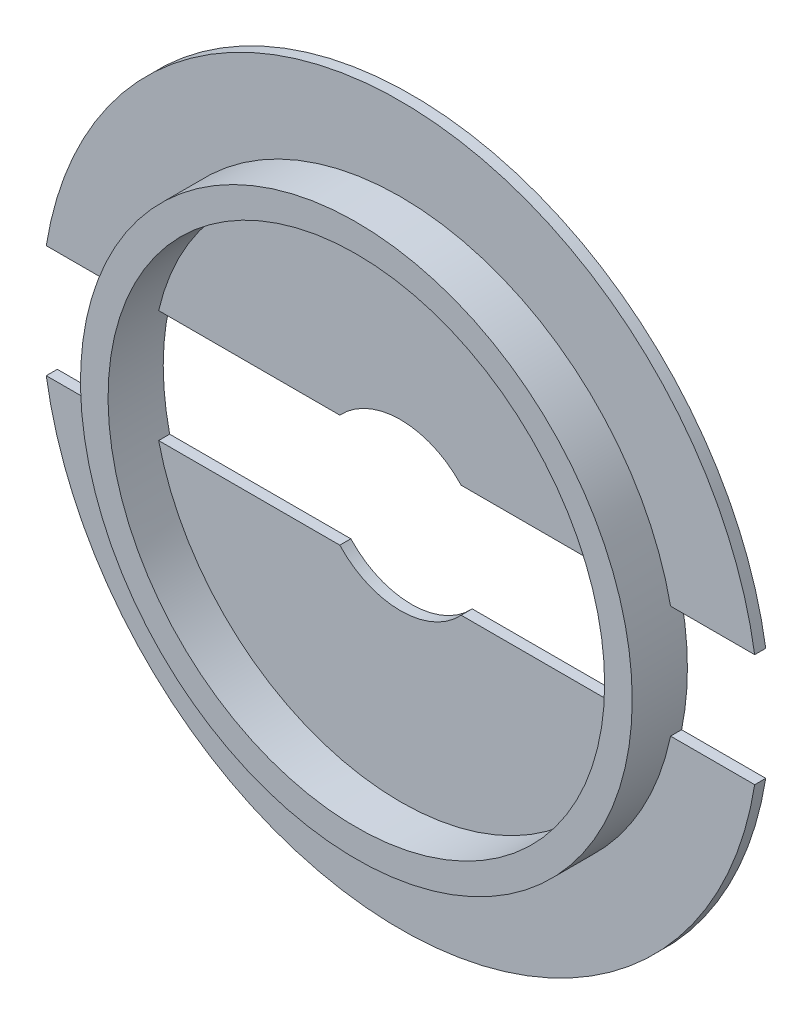
ISO-10303-21;
HEADER;
FILE_DESCRIPTION(('STEP AP214'),'2;1');
FILE_NAME('part.step','',(''),(''),'','','');
FILE_SCHEMA(('AUTOMOTIVE_DESIGN { 1 0 10303 214 1 1 1 1 }'));
ENDSEC;
DATA;
#1=APPLICATION_CONTEXT('core data for automotive mechanical design processes');
#2=APPLICATION_PROTOCOL_DEFINITION('international standard','automotive_design',2000,#1);
#3=PRODUCT_CONTEXT('',#1,'mechanical');
#4=PRODUCT('Part','Part','',(#3));
#5=PRODUCT_RELATED_PRODUCT_CATEGORY('part','',(#4));
#6=PRODUCT_DEFINITION_FORMATION('','',#4);
#7=PRODUCT_DEFINITION_CONTEXT('part definition',#1,'design');
#8=PRODUCT_DEFINITION('design','',#6,#7);
#9=PRODUCT_DEFINITION_SHAPE('','',#8);
#10=(LENGTH_UNIT() NAMED_UNIT(*) SI_UNIT(.MILLI.,.METRE.));
#11=(NAMED_UNIT(*) PLANE_ANGLE_UNIT() SI_UNIT($,.RADIAN.));
#12=(NAMED_UNIT(*) SI_UNIT($,.STERADIAN.) SOLID_ANGLE_UNIT());
#13=UNCERTAINTY_MEASURE_WITH_UNIT(LENGTH_MEASURE(1.E-05),#10,'distance_accuracy_value','');
#14=(GEOMETRIC_REPRESENTATION_CONTEXT(3) GLOBAL_UNCERTAINTY_ASSIGNED_CONTEXT((#13)) GLOBAL_UNIT_ASSIGNED_CONTEXT((#10,
#11,#12)) REPRESENTATION_CONTEXT('',''));
#15=CARTESIAN_POINT('',(0.,0.,0.));
#16=DIRECTION('',(0.,0.,1.));
#17=DIRECTION('',(1.,0.,0.));
#18=AXIS2_PLACEMENT_3D('',#15,#16,#17);
#19=CARTESIAN_POINT('',(0.,0.,10.));
#20=DIRECTION('',(0.,0.,-1.));
#21=DIRECTION('',(-1.,0.,0.));
#22=AXIS2_PLACEMENT_3D('',#19,#20,#21);
#23=CYLINDRICAL_SURFACE('',#22,50.);
#24=CARTESIAN_POINT('',(0.,0.,10.));
#25=DIRECTION('',(0.,0.,1.));
#26=DIRECTION('',(1.,0.,0.));
#27=AXIS2_PLACEMENT_3D('',#24,#25,#26);
#28=CIRCLE('',#27,50.);
#29=CARTESIAN_POINT('',(50.,0.,10.));
#30=VERTEX_POINT('',#29);
#31=EDGE_CURVE('E236',#30,#30,#28,.T.);
#32=ORIENTED_EDGE('',*,*,#31,.F.);
#33=EDGE_LOOP('',(#32));
#34=FACE_BOUND('',#33,.T.);
#35=DIRECTION('',(0.,0.,-1.));
#36=VECTOR('',#35,1.);
#37=CARTESIAN_POINT('',(-48.9485444114531,-10.2,10.));
#38=LINE('',#37,#36);
#39=CARTESIAN_POINT('',(-48.9485444114531,-10.2,2.));
#40=VERTEX_POINT('',#39);
#41=CARTESIAN_POINT('',(-48.9485444114531,-10.2,0.));
#42=VERTEX_POINT('',#41);
#43=EDGE_CURVE('E68',#40,#42,#38,.T.);
#44=ORIENTED_EDGE('',*,*,#43,.F.);
#45=CARTESIAN_POINT('',(0.,0.,2.));
#46=DIRECTION('',(0.,0.,1.));
#47=DIRECTION('',(1.,0.,0.));
#48=AXIS2_PLACEMENT_3D('',#45,#46,#47);
#49=CIRCLE('',#48,50.);
#50=CARTESIAN_POINT('',(48.9485444114531,-10.2,2.));
#51=VERTEX_POINT('',#50);
#52=EDGE_CURVE('E63',#40,#51,#49,.T.);
#53=ORIENTED_EDGE('',*,*,#52,.T.);
#54=DIRECTION('',(0.,0.,-1.));
#55=VECTOR('',#54,1.);
#56=CARTESIAN_POINT('',(48.9485444114531,-10.2,10.));
#57=LINE('',#56,#55);
#58=CARTESIAN_POINT('',(48.9485444114531,-10.2,0.));
#59=VERTEX_POINT('',#58);
#60=EDGE_CURVE('E221',#51,#59,#57,.T.);
#61=ORIENTED_EDGE('',*,*,#60,.T.);
#62=CARTESIAN_POINT('',(0.,0.,0.));
#63=DIRECTION('',(0.,0.,1.));
#64=DIRECTION('',(1.,0.,0.));
#65=AXIS2_PLACEMENT_3D('',#62,#63,#64);
#66=CIRCLE('',#65,50.);
#67=CARTESIAN_POINT('',(48.9485444114531,10.2,0.));
#68=VERTEX_POINT('',#67);
#69=EDGE_CURVE('E231',#59,#68,#66,.T.);
#70=ORIENTED_EDGE('',*,*,#69,.T.);
#71=DIRECTION('',(0.,0.,-1.));
#72=VECTOR('',#71,1.);
#73=CARTESIAN_POINT('',(48.9485444114531,10.2,10.));
#74=LINE('',#73,#72);
#75=CARTESIAN_POINT('',(48.9485444114531,10.2,2.));
#76=VERTEX_POINT('',#75);
#77=EDGE_CURVE('E261',#68,#76,#74,.F.);
#78=ORIENTED_EDGE('',*,*,#77,.T.);
#79=CARTESIAN_POINT('',(0.,0.,2.));
#80=DIRECTION('',(0.,0.,1.));
#81=DIRECTION('',(1.,0.,0.));
#82=AXIS2_PLACEMENT_3D('',#79,#80,#81);
#83=CIRCLE('',#82,50.);
#84=CARTESIAN_POINT('',(-48.9485444114531,10.2,2.));
#85=VERTEX_POINT('',#84);
#86=EDGE_CURVE('E255',#85,#76,#83,.F.);
#87=ORIENTED_EDGE('',*,*,#86,.F.);
#88=DIRECTION('',(0.,0.,-1.));
#89=VECTOR('',#88,1.);
#90=CARTESIAN_POINT('',(-48.9485444114531,10.2,10.));
#91=LINE('',#90,#89);
#92=CARTESIAN_POINT('',(-48.9485444114531,10.2,0.));
#93=VERTEX_POINT('',#92);
#94=EDGE_CURVE('E258',#93,#85,#91,.F.);
#95=ORIENTED_EDGE('',*,*,#94,.F.);
#96=EDGE_CURVE('E241',#93,#42,#66,.T.);
#97=ORIENTED_EDGE('',*,*,#96,.T.);
#98=EDGE_LOOP('',(#44,#53,#61,#70,#78,#87,#95,#97));
#99=FACE_BOUND('',#98,.T.);
#100=ADVANCED_FACE('F47',(#34,#99),#23,.T.);
#101=CARTESIAN_POINT('',(0.,0.,10.));
#102=DIRECTION('',(0.,0.,-1.));
#103=DIRECTION('',(-1.,0.,0.));
#104=AXIS2_PLACEMENT_3D('',#101,#102,#103);
#105=CYLINDRICAL_SURFACE('',#104,45.);
#106=CARTESIAN_POINT('',(0.,0.,10.));
#107=DIRECTION('',(0.,0.,1.));
#108=DIRECTION('',(1.,0.,0.));
#109=AXIS2_PLACEMENT_3D('',#106,#107,#108);
#110=CIRCLE('',#109,45.);
#111=CARTESIAN_POINT('',(45.,0.,10.));
#112=VERTEX_POINT('',#111);
#113=EDGE_CURVE('E227',#112,#112,#110,.T.);
#114=ORIENTED_EDGE('',*,*,#113,.T.);
#115=EDGE_LOOP('',(#114));
#116=FACE_BOUND('',#115,.T.);
#117=CARTESIAN_POINT('',(0.,0.,2.));
#118=DIRECTION('',(0.,0.,1.));
#119=DIRECTION('',(1.,0.,0.));
#120=AXIS2_PLACEMENT_3D('',#117,#118,#119);
#121=CIRCLE('',#120,45.);
#122=CARTESIAN_POINT('',(-43.8287576825992,-10.2,2.));
#123=VERTEX_POINT('',#122);
#124=CARTESIAN_POINT('',(43.8287576825992,-10.2,2.));
#125=VERTEX_POINT('',#124);
#126=EDGE_CURVE('E314',#123,#125,#121,.T.);
#127=ORIENTED_EDGE('',*,*,#126,.F.);
#128=DIRECTION('',(0.,0.,-1.));
#129=VECTOR('',#128,1.);
#130=CARTESIAN_POINT('',(-43.8287576825992,-10.2,10.));
#131=LINE('',#130,#129);
#132=CARTESIAN_POINT('',(-43.8287576825992,-10.2,0.));
#133=VERTEX_POINT('',#132);
#134=EDGE_CURVE('E11',#123,#133,#131,.T.);
#135=ORIENTED_EDGE('',*,*,#134,.T.);
#136=CARTESIAN_POINT('',(0.,0.,0.));
#137=DIRECTION('',(0.,0.,1.));
#138=DIRECTION('',(1.,0.,0.));
#139=AXIS2_PLACEMENT_3D('',#136,#137,#138);
#140=CIRCLE('',#139,45.);
#141=CARTESIAN_POINT('',(-43.8287576825992,10.2,0.));
#142=VERTEX_POINT('',#141);
#143=EDGE_CURVE('E232',#142,#133,#140,.T.);
#144=ORIENTED_EDGE('',*,*,#143,.F.);
#145=DIRECTION('',(0.,0.,-1.));
#146=VECTOR('',#145,1.);
#147=CARTESIAN_POINT('',(-43.8287576825992,10.2,10.));
#148=LINE('',#147,#146);
#149=CARTESIAN_POINT('',(-43.8287576825992,10.2,2.));
#150=VERTEX_POINT('',#149);
#151=EDGE_CURVE('E247',#142,#150,#148,.F.);
#152=ORIENTED_EDGE('',*,*,#151,.T.);
#153=CARTESIAN_POINT('',(0.,0.,2.));
#154=DIRECTION('',(0.,0.,1.));
#155=DIRECTION('',(1.,0.,0.));
#156=AXIS2_PLACEMENT_3D('',#153,#154,#155);
#157=CIRCLE('',#156,45.);
#158=CARTESIAN_POINT('',(43.8287576825992,10.2,2.));
#159=VERTEX_POINT('',#158);
#160=EDGE_CURVE('E240',#150,#159,#157,.F.);
#161=ORIENTED_EDGE('',*,*,#160,.T.);
#162=DIRECTION('',(0.,0.,-1.));
#163=VECTOR('',#162,1.);
#164=CARTESIAN_POINT('',(43.8287576825992,10.2,10.));
#165=LINE('',#164,#163);
#166=CARTESIAN_POINT('',(43.8287576825992,10.2,0.));
#167=VERTEX_POINT('',#166);
#168=EDGE_CURVE('E251',#167,#159,#165,.F.);
#169=ORIENTED_EDGE('',*,*,#168,.F.);
#170=CARTESIAN_POINT('',(43.8287576825992,-10.2,0.));
#171=VERTEX_POINT('',#170);
#172=EDGE_CURVE('E226',#171,#167,#140,.T.);
#173=ORIENTED_EDGE('',*,*,#172,.F.);
#174=DIRECTION('',(0.,0.,-1.));
#175=VECTOR('',#174,1.);
#176=CARTESIAN_POINT('',(43.8287576825992,-10.2,10.));
#177=LINE('',#176,#175);
#178=EDGE_CURVE('E56',#125,#171,#177,.T.);
#179=ORIENTED_EDGE('',*,*,#178,.F.);
#180=EDGE_LOOP('',(#127,#135,#144,#152,#161,#169,#173,#179));
#181=FACE_BOUND('',#180,.T.);
#182=ADVANCED_FACE('F325',(#116,#181),#105,.F.);
#183=CARTESIAN_POINT('',(0.,10.2,2.));
#184=DIRECTION('',(0.,1.,0.));
#185=DIRECTION('',(0.,0.,1.));
#186=AXIS2_PLACEMENT_3D('',#183,#184,#185);
#187=PLANE('',#186);
#188=ORIENTED_EDGE('',*,*,#77,.F.);
#189=DIRECTION('',(1.,0.,0.));
#190=VECTOR('',#189,1.);
#191=CARTESIAN_POINT('',(0.,10.2,0.));
#192=LINE('',#191,#190);
#193=CARTESIAN_POINT('',(64.194703831391,10.2,0.));
#194=VERTEX_POINT('',#193);
#195=EDGE_CURVE('E288',#68,#194,#192,.T.);
#196=ORIENTED_EDGE('',*,*,#195,.T.);
#197=DIRECTION('',(0.,0.,-1.));
#198=VECTOR('',#197,1.);
#199=CARTESIAN_POINT('',(64.194703831391,10.2,2.));
#200=LINE('',#199,#198);
#201=CARTESIAN_POINT('',(64.194703831391,10.2,2.));
#202=VERTEX_POINT('',#201);
#203=EDGE_CURVE('E307',#202,#194,#200,.T.);
#204=ORIENTED_EDGE('',*,*,#203,.F.);
#205=DIRECTION('',(1.,0.,0.));
#206=VECTOR('',#205,1.);
#207=CARTESIAN_POINT('',(0.,10.2,2.));
#208=LINE('',#207,#206);
#209=EDGE_CURVE('E270',#76,#202,#208,.T.);
#210=ORIENTED_EDGE('',*,*,#209,.F.);
#211=EDGE_LOOP('',(#188,#196,#204,#210));
#212=FACE_BOUND('',#211,.T.);
#213=ADVANCED_FACE('F368',(#212),#187,.F.);
#214=CARTESIAN_POINT('',(0.,10.2,2.));
#215=DIRECTION('',(0.,-1.,0.));
#216=DIRECTION('',(1.,0.,0.));
#217=AXIS2_PLACEMENT_3D('',#214,#215,#216);
#218=PLANE('',#217);
#219=DIRECTION('',(-1.,0.,0.));
#220=VECTOR('',#219,1.);
#221=CARTESIAN_POINT('',(0.,10.2,0.));
#222=LINE('',#221,#220);
#223=CARTESIAN_POINT('',(-64.194703831391,10.2,0.));
#224=VERTEX_POINT('',#223);
#225=EDGE_CURVE('E297',#93,#224,#222,.T.);
#226=ORIENTED_EDGE('',*,*,#225,.F.);
#227=ORIENTED_EDGE('',*,*,#94,.T.);
#228=DIRECTION('',(-1.,0.,0.));
#229=VECTOR('',#228,1.);
#230=CARTESIAN_POINT('',(0.,10.2,2.));
#231=LINE('',#230,#229);
#232=CARTESIAN_POINT('',(-64.194703831391,10.2,2.));
#233=VERTEX_POINT('',#232);
#234=EDGE_CURVE('E279',#85,#233,#231,.T.);
#235=ORIENTED_EDGE('',*,*,#234,.T.);
#236=DIRECTION('',(0.,0.,-1.));
#237=VECTOR('',#236,1.);
#238=CARTESIAN_POINT('',(-64.194703831391,10.2,2.));
#239=LINE('',#238,#237);
#240=EDGE_CURVE('E303',#233,#224,#239,.T.);
#241=ORIENTED_EDGE('',*,*,#240,.T.);
#242=EDGE_LOOP('',(#226,#227,#235,#241));
#243=FACE_BOUND('',#242,.T.);
#244=ADVANCED_FACE('F387',(#243),#218,.T.);
#245=CARTESIAN_POINT('',(0.,0.,2.));
#246=DIRECTION('',(0.,0.,1.));
#247=DIRECTION('',(1.,0.,0.));
#248=AXIS2_PLACEMENT_3D('',#245,#246,#247);
#249=PLANE('',#248);
#250=ORIENTED_EDGE('',*,*,#160,.F.);
#251=CARTESIAN_POINT('',(-10.998181667894,10.2,2.));
#252=VERTEX_POINT('',#251);
#253=EDGE_CURVE('E280',#252,#150,#231,.T.);
#254=ORIENTED_EDGE('',*,*,#253,.F.);
#255=CARTESIAN_POINT('',(0.,0.,2.));
#256=DIRECTION('',(0.,0.,1.));
#257=DIRECTION('',(1.,0.,0.));
#258=AXIS2_PLACEMENT_3D('',#255,#256,#257);
#259=CIRCLE('',#258,15.);
#260=CARTESIAN_POINT('',(10.998181667894,10.2,2.));
#261=VERTEX_POINT('',#260);
#262=EDGE_CURVE('E266',#261,#252,#259,.T.);
#263=ORIENTED_EDGE('',*,*,#262,.F.);
#264=EDGE_CURVE('E272',#261,#159,#208,.T.);
#265=ORIENTED_EDGE('',*,*,#264,.T.);
#266=EDGE_LOOP('',(#250,#254,#263,#265));
#267=FACE_BOUND('',#266,.T.);
#268=ADVANCED_FACE('F380',(#267),#249,.T.);
#269=CARTESIAN_POINT('',(0.,0.,2.));
#270=DIRECTION('',(0.,0.,-1.));
#271=DIRECTION('',(-1.,0.,0.));
#272=AXIS2_PLACEMENT_3D('',#269,#270,#271);
#273=CYLINDRICAL_SURFACE('',#272,15.);
#274=CARTESIAN_POINT('',(0.,0.,0.));
#275=DIRECTION('',(0.,0.,1.));
#276=DIRECTION('',(1.,0.,0.));
#277=AXIS2_PLACEMENT_3D('',#274,#275,#276);
#278=CIRCLE('',#277,15.);
#279=CARTESIAN_POINT('',(10.998181667894,10.2,0.));
#280=VERTEX_POINT('',#279);
#281=CARTESIAN_POINT('',(-10.998181667894,10.2,0.));
#282=VERTEX_POINT('',#281);
#283=EDGE_CURVE('E265',#280,#282,#278,.T.);
#284=ORIENTED_EDGE('',*,*,#283,.F.);
#285=DIRECTION('',(0.,0.,-1.));
#286=VECTOR('',#285,1.);
#287=CARTESIAN_POINT('',(10.998181667894,10.2,2.));
#288=LINE('',#287,#286);
#289=EDGE_CURVE('E311',#261,#280,#288,.T.);
#290=ORIENTED_EDGE('',*,*,#289,.F.);
#291=ORIENTED_EDGE('',*,*,#262,.T.);
#292=DIRECTION('',(0.,0.,-1.));
#293=VECTOR('',#292,1.);
#294=CARTESIAN_POINT('',(-10.998181667894,10.2,2.));
#295=LINE('',#294,#293);
#296=EDGE_CURVE('E284',#252,#282,#295,.T.);
#297=ORIENTED_EDGE('',*,*,#296,.T.);
#298=EDGE_LOOP('',(#284,#290,#291,#297));
#299=FACE_BOUND('',#298,.T.);
#300=ADVANCED_FACE('F49',(#299),#273,.F.);
#301=EDGE_CURVE('E289',#280,#167,#192,.T.);
#302=ORIENTED_EDGE('',*,*,#301,.T.);
#303=ORIENTED_EDGE('',*,*,#168,.T.);
#304=ORIENTED_EDGE('',*,*,#264,.F.);
#305=ORIENTED_EDGE('',*,*,#289,.T.);
#306=EDGE_LOOP('',(#302,#303,#304,#305));
#307=FACE_BOUND('',#306,.T.);
#308=ADVANCED_FACE('F389',(#307),#187,.F.);
#309=CARTESIAN_POINT('',(0.,0.,2.));
#310=DIRECTION('',(0.,0.,-1.));
#311=DIRECTION('',(-1.,0.,0.));
#312=AXIS2_PLACEMENT_3D('',#309,#310,#311);
#313=CYLINDRICAL_SURFACE('',#312,65.);
#314=CARTESIAN_POINT('',(0.,0.,0.));
#315=DIRECTION('',(0.,0.,1.));
#316=DIRECTION('',(1.,0.,0.));
#317=AXIS2_PLACEMENT_3D('',#314,#315,#316);
#318=CIRCLE('',#317,65.);
#319=EDGE_CURVE('E293',#194,#224,#318,.T.);
#320=ORIENTED_EDGE('',*,*,#319,.T.);
#321=ORIENTED_EDGE('',*,*,#240,.F.);
#322=CARTESIAN_POINT('',(0.,0.,2.));
#323=DIRECTION('',(0.,0.,1.));
#324=DIRECTION('',(1.,0.,0.));
#325=AXIS2_PLACEMENT_3D('',#322,#323,#324);
#326=CIRCLE('',#325,65.);
#327=EDGE_CURVE('E275',#202,#233,#326,.T.);
#328=ORIENTED_EDGE('',*,*,#327,.F.);
#329=ORIENTED_EDGE('',*,*,#203,.T.);
#330=EDGE_LOOP('',(#320,#321,#328,#329));
#331=FACE_BOUND('',#330,.T.);
#332=ADVANCED_FACE('F385',(#331),#313,.T.);
#333=ORIENTED_EDGE('',*,*,#151,.F.);
#334=EDGE_CURVE('E271',#282,#142,#222,.T.);
#335=ORIENTED_EDGE('',*,*,#334,.F.);
#336=ORIENTED_EDGE('',*,*,#296,.F.);
#337=ORIENTED_EDGE('',*,*,#253,.T.);
#338=EDGE_LOOP('',(#333,#335,#336,#337));
#339=FACE_BOUND('',#338,.T.);
#340=ADVANCED_FACE('F378',(#339),#218,.T.);
#341=ORIENTED_EDGE('',*,*,#234,.F.);
#342=ORIENTED_EDGE('',*,*,#86,.T.);
#343=ORIENTED_EDGE('',*,*,#209,.T.);
#344=ORIENTED_EDGE('',*,*,#327,.T.);
#345=EDGE_LOOP('',(#341,#342,#343,#344));
#346=FACE_BOUND('',#345,.T.);
#347=ADVANCED_FACE('F375',(#346),#249,.T.);
#348=CARTESIAN_POINT('',(0.,0.,0.));
#349=DIRECTION('',(0.,0.,1.));
#350=DIRECTION('',(1.,0.,0.));
#351=AXIS2_PLACEMENT_3D('',#348,#349,#350);
#352=PLANE('',#351);
#353=ORIENTED_EDGE('',*,*,#143,.T.);
#354=DIRECTION('',(-1.,0.,0.));
#355=VECTOR('',#354,1.);
#356=CARTESIAN_POINT('',(0.,-10.2,0.));
#357=LINE('',#356,#355);
#358=CARTESIAN_POINT('',(-10.998181667894,-10.2,0.));
#359=VERTEX_POINT('',#358);
#360=EDGE_CURVE('E203',#359,#133,#357,.T.);
#361=ORIENTED_EDGE('',*,*,#360,.F.);
#362=CARTESIAN_POINT('',(0.,0.,0.));
#363=DIRECTION('',(0.,0.,1.));
#364=DIRECTION('',(1.,0.,0.));
#365=AXIS2_PLACEMENT_3D('',#362,#363,#364);
#366=CIRCLE('',#365,15.);
#367=CARTESIAN_POINT('',(10.998181667894,-10.2,0.));
#368=VERTEX_POINT('',#367);
#369=EDGE_CURVE('E167',#359,#368,#366,.T.);
#370=ORIENTED_EDGE('',*,*,#369,.T.);
#371=DIRECTION('',(1.,0.,0.));
#372=VECTOR('',#371,1.);
#373=CARTESIAN_POINT('',(0.,-10.2,0.));
#374=LINE('',#373,#372);
#375=EDGE_CURVE('E186',#368,#171,#374,.T.);
#376=ORIENTED_EDGE('',*,*,#375,.T.);
#377=ORIENTED_EDGE('',*,*,#172,.T.);
#378=ORIENTED_EDGE('',*,*,#301,.F.);
#379=ORIENTED_EDGE('',*,*,#283,.T.);
#380=ORIENTED_EDGE('',*,*,#334,.T.);
#381=EDGE_LOOP('',(#353,#361,#370,#376,#377,#378,#379,#380));
#382=FACE_BOUND('',#381,.T.);
#383=CARTESIAN_POINT('',(-64.194703831391,-10.2,0.));
#384=VERTEX_POINT('',#383);
#385=EDGE_CURVE('E202',#42,#384,#357,.T.);
#386=ORIENTED_EDGE('',*,*,#385,.F.);
#387=ORIENTED_EDGE('',*,*,#96,.F.);
#388=ORIENTED_EDGE('',*,*,#225,.T.);
#389=ORIENTED_EDGE('',*,*,#319,.F.);
#390=ORIENTED_EDGE('',*,*,#195,.F.);
#391=ORIENTED_EDGE('',*,*,#69,.F.);
#392=CARTESIAN_POINT('',(64.194703831391,-10.2,0.));
#393=VERTEX_POINT('',#392);
#394=EDGE_CURVE('E190',#59,#393,#374,.T.);
#395=ORIENTED_EDGE('',*,*,#394,.T.);
#396=CARTESIAN_POINT('',(0.,0.,0.));
#397=DIRECTION('',(0.,0.,1.));
#398=DIRECTION('',(1.,0.,0.));
#399=AXIS2_PLACEMENT_3D('',#396,#397,#398);
#400=CIRCLE('',#399,65.);
#401=EDGE_CURVE('E206',#384,#393,#400,.T.);
#402=ORIENTED_EDGE('',*,*,#401,.F.);
#403=EDGE_LOOP('',(#386,#387,#388,#389,#390,#391,#395,#402));
#404=FACE_BOUND('',#403,.T.);
#405=ADVANCED_FACE('F345',(#382,#404),#352,.F.);
#406=CARTESIAN_POINT('',(0.,0.,10.));
#407=DIRECTION('',(0.,0.,1.));
#408=DIRECTION('',(1.,0.,0.));
#409=AXIS2_PLACEMENT_3D('',#406,#407,#408);
#410=PLANE('',#409);
#411=ORIENTED_EDGE('',*,*,#31,.T.);
#412=EDGE_LOOP('',(#411));
#413=FACE_BOUND('',#412,.T.);
#414=ORIENTED_EDGE('',*,*,#113,.F.);
#415=EDGE_LOOP('',(#414));
#416=FACE_BOUND('',#415,.T.);
#417=ADVANCED_FACE('F374',(#413,#416),#410,.T.);
#418=CARTESIAN_POINT('',(0.,0.,2.));
#419=DIRECTION('',(0.,0.,-1.));
#420=DIRECTION('',(-1.,0.,0.));
#421=AXIS2_PLACEMENT_3D('',#418,#419,#420);
#422=CYLINDRICAL_SURFACE('',#421,15.);
#423=ORIENTED_EDGE('',*,*,#369,.F.);
#424=DIRECTION('',(0.,0.,-1.));
#425=VECTOR('',#424,1.);
#426=CARTESIAN_POINT('',(-10.998181667894,-10.2,2.));
#427=LINE('',#426,#425);
#428=CARTESIAN_POINT('',(-10.998181667894,-10.2,2.));
#429=VERTEX_POINT('',#428);
#430=EDGE_CURVE('E160',#429,#359,#427,.T.);
#431=ORIENTED_EDGE('',*,*,#430,.F.);
#432=CARTESIAN_POINT('',(0.,0.,2.));
#433=DIRECTION('',(0.,0.,1.));
#434=DIRECTION('',(1.,0.,0.));
#435=AXIS2_PLACEMENT_3D('',#432,#433,#434);
#436=CIRCLE('',#435,15.);
#437=CARTESIAN_POINT('',(10.998181667894,-10.2,2.));
#438=VERTEX_POINT('',#437);
#439=EDGE_CURVE('E164',#429,#438,#436,.T.);
#440=ORIENTED_EDGE('',*,*,#439,.T.);
#441=DIRECTION('',(0.,0.,-1.));
#442=VECTOR('',#441,1.);
#443=CARTESIAN_POINT('',(10.998181667894,-10.2,2.));
#444=LINE('',#443,#442);
#445=EDGE_CURVE('E199',#438,#368,#444,.T.);
#446=ORIENTED_EDGE('',*,*,#445,.T.);
#447=EDGE_LOOP('',(#423,#431,#440,#446));
#448=FACE_BOUND('',#447,.T.);
#449=ADVANCED_FACE('F162',(#448),#422,.F.);
#450=CARTESIAN_POINT('',(0.,0.,2.));
#451=DIRECTION('',(0.,0.,1.));
#452=DIRECTION('',(1.,0.,0.));
#453=AXIS2_PLACEMENT_3D('',#450,#451,#452);
#454=PLANE('',#453);
#455=DIRECTION('',(-1.,0.,0.));
#456=VECTOR('',#455,1.);
#457=CARTESIAN_POINT('',(0.,-10.2,2.));
#458=LINE('',#457,#456);
#459=EDGE_CURVE('E174',#429,#123,#458,.T.);
#460=ORIENTED_EDGE('',*,*,#459,.T.);
#461=ORIENTED_EDGE('',*,*,#126,.T.);
#462=DIRECTION('',(1.,0.,0.));
#463=VECTOR('',#462,1.);
#464=CARTESIAN_POINT('',(0.,-10.2,2.));
#465=LINE('',#464,#463);
#466=EDGE_CURVE('E184',#438,#125,#465,.T.);
#467=ORIENTED_EDGE('',*,*,#466,.F.);
#468=ORIENTED_EDGE('',*,*,#439,.F.);
#469=EDGE_LOOP('',(#460,#461,#467,#468));
#470=FACE_BOUND('',#469,.T.);
#471=ADVANCED_FACE('F182',(#470),#454,.T.);
#472=CARTESIAN_POINT('',(0.,-10.2,2.));
#473=DIRECTION('',(0.,1.,0.));
#474=DIRECTION('',(0.,0.,1.));
#475=AXIS2_PLACEMENT_3D('',#472,#473,#474);
#476=PLANE('',#475);
#477=ORIENTED_EDGE('',*,*,#466,.T.);
#478=ORIENTED_EDGE('',*,*,#178,.T.);
#479=ORIENTED_EDGE('',*,*,#375,.F.);
#480=ORIENTED_EDGE('',*,*,#445,.F.);
#481=EDGE_LOOP('',(#477,#478,#479,#480));
#482=FACE_BOUND('',#481,.T.);
#483=ADVANCED_FACE('F322',(#482),#476,.T.);
#484=CARTESIAN_POINT('',(0.,-10.2,2.));
#485=DIRECTION('',(0.,-1.,0.));
#486=DIRECTION('',(0.,0.,-1.));
#487=AXIS2_PLACEMENT_3D('',#484,#485,#486);
#488=PLANE('',#487);
#489=ORIENTED_EDGE('',*,*,#134,.F.);
#490=ORIENTED_EDGE('',*,*,#459,.F.);
#491=ORIENTED_EDGE('',*,*,#430,.T.);
#492=ORIENTED_EDGE('',*,*,#360,.T.);
#493=EDGE_LOOP('',(#489,#490,#491,#492));
#494=FACE_BOUND('',#493,.T.);
#495=ADVANCED_FACE('F175',(#494),#488,.F.);
#496=CARTESIAN_POINT('',(-64.194703831391,-10.2,2.));
#497=VERTEX_POINT('',#496);
#498=EDGE_CURVE('E180',#40,#497,#458,.T.);
#499=ORIENTED_EDGE('',*,*,#498,.F.);
#500=ORIENTED_EDGE('',*,*,#43,.T.);
#501=ORIENTED_EDGE('',*,*,#385,.T.);
#502=DIRECTION('',(0.,0.,-1.));
#503=VECTOR('',#502,1.);
#504=CARTESIAN_POINT('',(-64.194703831391,-10.2,2.));
#505=LINE('',#504,#503);
#506=EDGE_CURVE('E171',#497,#384,#505,.T.);
#507=ORIENTED_EDGE('',*,*,#506,.F.);
#508=EDGE_LOOP('',(#499,#500,#501,#507));
#509=FACE_BOUND('',#508,.T.);
#510=ADVANCED_FACE('F351',(#509),#488,.F.);
#511=ORIENTED_EDGE('',*,*,#60,.F.);
#512=CARTESIAN_POINT('',(64.194703831391,-10.2,2.));
#513=VERTEX_POINT('',#512);
#514=EDGE_CURVE('E196',#51,#513,#465,.T.);
#515=ORIENTED_EDGE('',*,*,#514,.T.);
#516=DIRECTION('',(0.,0.,-1.));
#517=VECTOR('',#516,1.);
#518=CARTESIAN_POINT('',(64.194703831391,-10.2,2.));
#519=LINE('',#518,#517);
#520=EDGE_CURVE('E212',#513,#393,#519,.T.);
#521=ORIENTED_EDGE('',*,*,#520,.T.);
#522=ORIENTED_EDGE('',*,*,#394,.F.);
#523=EDGE_LOOP('',(#511,#515,#521,#522));
#524=FACE_BOUND('',#523,.T.);
#525=ADVANCED_FACE('F332',(#524),#476,.T.);
#526=CARTESIAN_POINT('',(0.,0.,2.));
#527=DIRECTION('',(0.,0.,-1.));
#528=DIRECTION('',(-1.,0.,0.));
#529=AXIS2_PLACEMENT_3D('',#526,#527,#528);
#530=CYLINDRICAL_SURFACE('',#529,65.);
#531=ORIENTED_EDGE('',*,*,#401,.T.);
#532=ORIENTED_EDGE('',*,*,#520,.F.);
#533=CARTESIAN_POINT('',(0.,0.,2.));
#534=DIRECTION('',(0.,0.,1.));
#535=DIRECTION('',(1.,0.,0.));
#536=AXIS2_PLACEMENT_3D('',#533,#534,#535);
#537=CIRCLE('',#536,65.);
#538=EDGE_CURVE('E179',#497,#513,#537,.T.);
#539=ORIENTED_EDGE('',*,*,#538,.F.);
#540=ORIENTED_EDGE('',*,*,#506,.T.);
#541=EDGE_LOOP('',(#531,#532,#539,#540));
#542=FACE_BOUND('',#541,.T.);
#543=ADVANCED_FACE('F341',(#542),#530,.T.);
#544=ORIENTED_EDGE('',*,*,#52,.F.);
#545=ORIENTED_EDGE('',*,*,#498,.T.);
#546=ORIENTED_EDGE('',*,*,#538,.T.);
#547=ORIENTED_EDGE('',*,*,#514,.F.);
#548=EDGE_LOOP('',(#544,#545,#546,#547));
#549=FACE_BOUND('',#548,.T.);
#550=ADVANCED_FACE('F337',(#549),#454,.T.);
#551=CLOSED_SHELL('',(#100,#182,#213,#244,#268,#300,#308,#332,#340,#347,#405,#417,#449,#471,
#483,#495,#510,#525,#543,#550));
#552=MANIFOLD_SOLID_BREP('B2',#551);
#553=ADVANCED_BREP_SHAPE_REPRESENTATION('',(#18,#552),#14);
#554=SHAPE_DEFINITION_REPRESENTATION(#9,#553);
ENDSEC;
END-ISO-10303-21;
